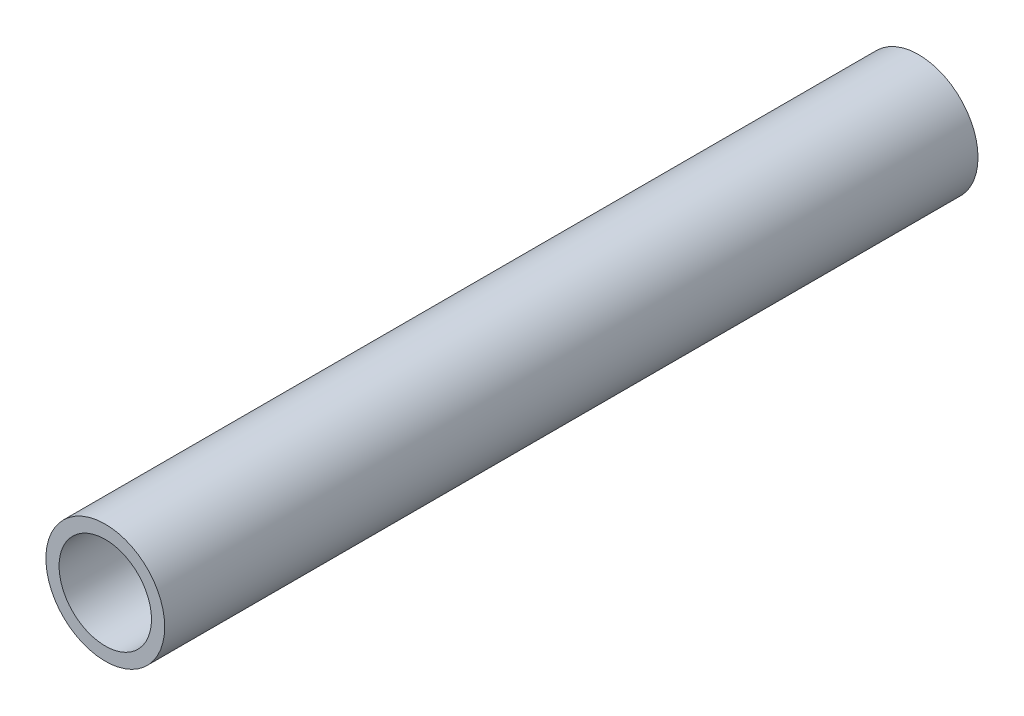
ISO-10303-21;
HEADER;
FILE_DESCRIPTION(('STEP AP214'),'2;1');
FILE_NAME('part.step','',(''),(''),'','','');
FILE_SCHEMA(('AUTOMOTIVE_DESIGN { 1 0 10303 214 1 1 1 1 }'));
ENDSEC;
DATA;
#1=APPLICATION_CONTEXT('core data for automotive mechanical design processes');
#2=APPLICATION_PROTOCOL_DEFINITION('international standard','automotive_design',2000,#1);
#3=PRODUCT_CONTEXT('',#1,'mechanical');
#4=PRODUCT('Part','Part','',(#3));
#5=PRODUCT_RELATED_PRODUCT_CATEGORY('part','',(#4));
#6=PRODUCT_DEFINITION_FORMATION('','',#4);
#7=PRODUCT_DEFINITION_CONTEXT('part definition',#1,'design');
#8=PRODUCT_DEFINITION('design','',#6,#7);
#9=PRODUCT_DEFINITION_SHAPE('','',#8);
#10=(LENGTH_UNIT() NAMED_UNIT(*) SI_UNIT(.MILLI.,.METRE.));
#11=(NAMED_UNIT(*) PLANE_ANGLE_UNIT() SI_UNIT($,.RADIAN.));
#12=(NAMED_UNIT(*) SI_UNIT($,.STERADIAN.) SOLID_ANGLE_UNIT());
#13=UNCERTAINTY_MEASURE_WITH_UNIT(LENGTH_MEASURE(1.E-05),#10,'distance_accuracy_value','');
#14=(GEOMETRIC_REPRESENTATION_CONTEXT(3) GLOBAL_UNCERTAINTY_ASSIGNED_CONTEXT((#13)) GLOBAL_UNIT_ASSIGNED_CONTEXT((#10,
#11,#12)) REPRESENTATION_CONTEXT('',''));
#15=CARTESIAN_POINT('',(0.,0.,0.));
#16=DIRECTION('',(0.,0.,1.));
#17=DIRECTION('',(1.,0.,0.));
#18=AXIS2_PLACEMENT_3D('',#15,#16,#17);
#19=CARTESIAN_POINT('',(0.,0.,61.61));
#20=DIRECTION('',(0.,0.,1.));
#21=DIRECTION('',(1.,0.,0.));
#22=AXIS2_PLACEMENT_3D('',#19,#20,#21);
#23=PLANE('',#22);
#24=CARTESIAN_POINT('',(0.,0.,61.61));
#25=DIRECTION('',(0.,0.,1.));
#26=DIRECTION('',(1.,0.,0.));
#27=AXIS2_PLACEMENT_3D('',#24,#25,#26);
#28=CIRCLE('',#27,9.);
#29=CARTESIAN_POINT('',(9.,0.,61.61));
#30=VERTEX_POINT('',#29);
#31=EDGE_CURVE('E10',#30,#30,#28,.T.);
#32=ORIENTED_EDGE('',*,*,#31,.T.);
#33=EDGE_LOOP('',(#32));
#34=FACE_BOUND('',#33,.T.);
#35=CARTESIAN_POINT('',(0.,0.,61.61));
#36=DIRECTION('',(0.,0.,1.));
#37=DIRECTION('',(1.,0.,0.));
#38=AXIS2_PLACEMENT_3D('',#35,#36,#37);
#39=CIRCLE('',#38,7.);
#40=CARTESIAN_POINT('',(7.,0.,61.61));
#41=VERTEX_POINT('',#40);
#42=EDGE_CURVE('E44',#41,#41,#39,.T.);
#43=ORIENTED_EDGE('',*,*,#42,.F.);
#44=EDGE_LOOP('',(#43));
#45=FACE_BOUND('',#44,.T.);
#46=ADVANCED_FACE('F33',(#34,#45),#23,.T.);
#47=CARTESIAN_POINT('',(0.,0.,-61.61));
#48=DIRECTION('',(0.,0.,1.));
#49=DIRECTION('',(1.,0.,0.));
#50=AXIS2_PLACEMENT_3D('',#47,#48,#49);
#51=PLANE('',#50);
#52=CARTESIAN_POINT('',(0.,0.,-61.61));
#53=DIRECTION('',(0.,0.,1.));
#54=DIRECTION('',(1.,0.,0.));
#55=AXIS2_PLACEMENT_3D('',#52,#53,#54);
#56=CIRCLE('',#55,9.);
#57=CARTESIAN_POINT('',(9.,0.,-61.61));
#58=VERTEX_POINT('',#57);
#59=EDGE_CURVE('E37',#58,#58,#56,.T.);
#60=ORIENTED_EDGE('',*,*,#59,.F.);
#61=EDGE_LOOP('',(#60));
#62=FACE_BOUND('',#61,.T.);
#63=CARTESIAN_POINT('',(0.,0.,-61.61));
#64=DIRECTION('',(0.,0.,1.));
#65=DIRECTION('',(1.,0.,0.));
#66=AXIS2_PLACEMENT_3D('',#63,#64,#65);
#67=CIRCLE('',#66,7.);
#68=CARTESIAN_POINT('',(7.,0.,-61.61));
#69=VERTEX_POINT('',#68);
#70=EDGE_CURVE('E46',#69,#69,#67,.T.);
#71=ORIENTED_EDGE('',*,*,#70,.T.);
#72=EDGE_LOOP('',(#71));
#73=FACE_BOUND('',#72,.T.);
#74=ADVANCED_FACE('F56',(#62,#73),#51,.F.);
#75=CARTESIAN_POINT('',(0.,0.,61.61));
#76=DIRECTION('',(0.,0.,-1.));
#77=DIRECTION('',(-1.,0.,0.));
#78=AXIS2_PLACEMENT_3D('',#75,#76,#77);
#79=CYLINDRICAL_SURFACE('',#78,9.);
#80=ORIENTED_EDGE('',*,*,#31,.F.);
#81=EDGE_LOOP('',(#80));
#82=FACE_BOUND('',#81,.T.);
#83=ORIENTED_EDGE('',*,*,#59,.T.);
#84=EDGE_LOOP('',(#83));
#85=FACE_BOUND('',#84,.T.);
#86=ADVANCED_FACE('F35',(#82,#85),#79,.T.);
#87=CARTESIAN_POINT('',(0.,0.,61.61));
#88=DIRECTION('',(0.,0.,-1.));
#89=DIRECTION('',(-1.,0.,0.));
#90=AXIS2_PLACEMENT_3D('',#87,#88,#89);
#91=CYLINDRICAL_SURFACE('',#90,7.);
#92=ORIENTED_EDGE('',*,*,#42,.T.);
#93=EDGE_LOOP('',(#92));
#94=FACE_BOUND('',#93,.T.);
#95=ORIENTED_EDGE('',*,*,#70,.F.);
#96=EDGE_LOOP('',(#95));
#97=FACE_BOUND('',#96,.T.);
#98=ADVANCED_FACE('F52',(#94,#97),#91,.F.);
#99=CLOSED_SHELL('',(#46,#74,#86,#98));
#100=MANIFOLD_SOLID_BREP('B2',#99);
#101=ADVANCED_BREP_SHAPE_REPRESENTATION('',(#18,#100),#14);
#102=SHAPE_DEFINITION_REPRESENTATION(#9,#101);
ENDSEC;
END-ISO-10303-21;
